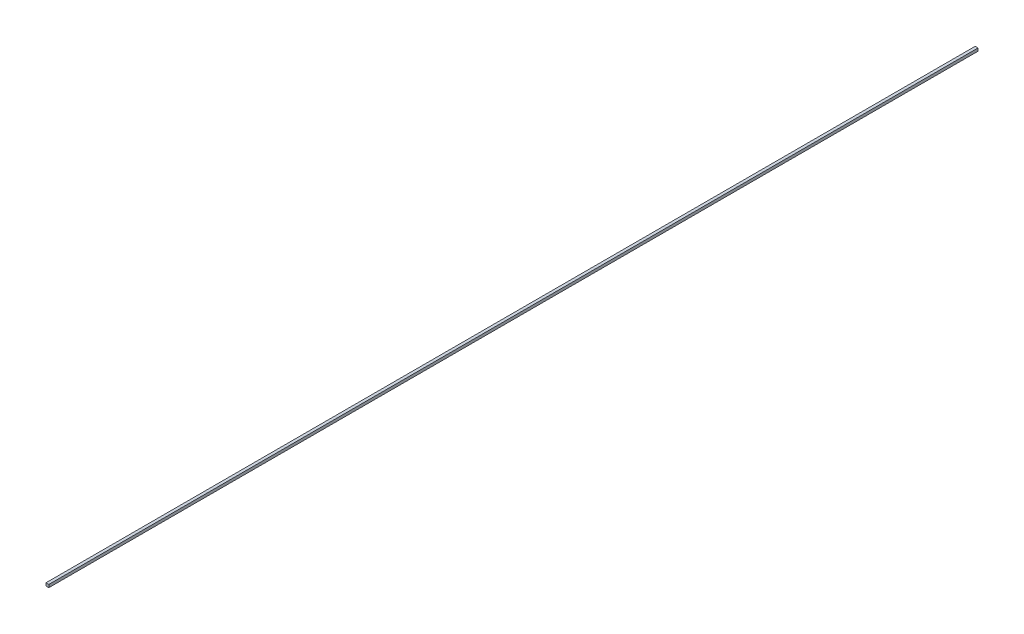
ISO-10303-21;
HEADER;
FILE_DESCRIPTION(('STEP AP214'),'2;1');
FILE_NAME('part.step','',(''),(''),'','','');
FILE_SCHEMA(('AUTOMOTIVE_DESIGN { 1 0 10303 214 1 1 1 1 }'));
ENDSEC;
DATA;
#1=APPLICATION_CONTEXT('core data for automotive mechanical design processes');
#2=APPLICATION_PROTOCOL_DEFINITION('international standard','automotive_design',2000,#1);
#3=PRODUCT_CONTEXT('',#1,'mechanical');
#4=PRODUCT('Part','Part','',(#3));
#5=PRODUCT_RELATED_PRODUCT_CATEGORY('part','',(#4));
#6=PRODUCT_DEFINITION_FORMATION('','',#4);
#7=PRODUCT_DEFINITION_CONTEXT('part definition',#1,'design');
#8=PRODUCT_DEFINITION('design','',#6,#7);
#9=PRODUCT_DEFINITION_SHAPE('','',#8);
#10=(LENGTH_UNIT() NAMED_UNIT(*) SI_UNIT(.MILLI.,.METRE.));
#11=(NAMED_UNIT(*) PLANE_ANGLE_UNIT() SI_UNIT($,.RADIAN.));
#12=(NAMED_UNIT(*) SI_UNIT($,.STERADIAN.) SOLID_ANGLE_UNIT());
#13=UNCERTAINTY_MEASURE_WITH_UNIT(LENGTH_MEASURE(1.E-05),#10,'distance_accuracy_value','');
#14=(GEOMETRIC_REPRESENTATION_CONTEXT(3) GLOBAL_UNCERTAINTY_ASSIGNED_CONTEXT((#13)) GLOBAL_UNIT_ASSIGNED_CONTEXT((#10,
#11,#12)) REPRESENTATION_CONTEXT('',''));
#15=CARTESIAN_POINT('',(0.,0.,0.));
#16=DIRECTION('',(0.,0.,1.));
#17=DIRECTION('',(1.,0.,0.));
#18=AXIS2_PLACEMENT_3D('',#15,#16,#17);
#19=CARTESIAN_POINT('',(0.,0.,651.8));
#20=DIRECTION('',(1.,0.,0.));
#21=DIRECTION('',(0.,0.,-1.));
#22=AXIS2_PLACEMENT_3D('',#19,#20,#21);
#23=PLANE('',#22);
#24=DIRECTION('',(0.,-1.,0.));
#25=VECTOR('',#24,1.);
#26=CARTESIAN_POINT('',(0.,0.,0.));
#27=LINE('',#26,#25);
#28=CARTESIAN_POINT('',(0.,2.,0.));
#29=VERTEX_POINT('',#28);
#30=CARTESIAN_POINT('',(0.,0.,0.));
#31=VERTEX_POINT('',#30);
#32=EDGE_CURVE('E100',#29,#31,#27,.T.);
#33=ORIENTED_EDGE('',*,*,#32,.T.);
#34=DIRECTION('',(0.,0.,-1.));
#35=VECTOR('',#34,1.);
#36=CARTESIAN_POINT('',(0.,0.,651.8));
#37=LINE('',#36,#35);
#38=CARTESIAN_POINT('',(0.,0.,651.8));
#39=VERTEX_POINT('',#38);
#40=EDGE_CURVE('E11',#39,#31,#37,.T.);
#41=ORIENTED_EDGE('',*,*,#40,.F.);
#42=DIRECTION('',(0.,-1.,0.));
#43=VECTOR('',#42,1.);
#44=CARTESIAN_POINT('',(0.,0.,651.8));
#45=LINE('',#44,#43);
#46=CARTESIAN_POINT('',(0.,2.,651.8));
#47=VERTEX_POINT('',#46);
#48=EDGE_CURVE('E88',#47,#39,#45,.T.);
#49=ORIENTED_EDGE('',*,*,#48,.F.);
#50=DIRECTION('',(0.,0.,-1.));
#51=VECTOR('',#50,1.);
#52=CARTESIAN_POINT('',(0.,2.,651.8));
#53=LINE('',#52,#51);
#54=EDGE_CURVE('E96',#47,#29,#53,.T.);
#55=ORIENTED_EDGE('',*,*,#54,.T.);
#56=EDGE_LOOP('',(#33,#41,#49,#55));
#57=FACE_BOUND('',#56,.T.);
#58=ADVANCED_FACE('F37',(#57),#23,.F.);
#59=CARTESIAN_POINT('',(0.,0.,651.8));
#60=DIRECTION('',(0.,1.,0.));
#61=DIRECTION('',(0.,0.,1.));
#62=AXIS2_PLACEMENT_3D('',#59,#60,#61);
#63=PLANE('',#62);
#64=DIRECTION('',(1.,0.,0.));
#65=VECTOR('',#64,1.);
#66=CARTESIAN_POINT('',(0.,0.,0.));
#67=LINE('',#66,#65);
#68=CARTESIAN_POINT('',(2.,0.,0.));
#69=VERTEX_POINT('',#68);
#70=EDGE_CURVE('E92',#31,#69,#67,.T.);
#71=ORIENTED_EDGE('',*,*,#70,.T.);
#72=DIRECTION('',(0.,0.,-1.));
#73=VECTOR('',#72,1.);
#74=CARTESIAN_POINT('',(2.,0.,651.8));
#75=LINE('',#74,#73);
#76=CARTESIAN_POINT('',(2.,0.,651.8));
#77=VERTEX_POINT('',#76);
#78=EDGE_CURVE('E45',#77,#69,#75,.T.);
#79=ORIENTED_EDGE('',*,*,#78,.F.);
#80=DIRECTION('',(1.,0.,0.));
#81=VECTOR('',#80,1.);
#82=CARTESIAN_POINT('',(0.,0.,651.8));
#83=LINE('',#82,#81);
#84=EDGE_CURVE('E83',#39,#77,#83,.T.);
#85=ORIENTED_EDGE('',*,*,#84,.F.);
#86=ORIENTED_EDGE('',*,*,#40,.T.);
#87=EDGE_LOOP('',(#71,#79,#85,#86));
#88=FACE_BOUND('',#87,.T.);
#89=ADVANCED_FACE('F91',(#88),#63,.F.);
#90=CARTESIAN_POINT('',(2.,0.,651.8));
#91=DIRECTION('',(-1.,0.,0.));
#92=DIRECTION('',(0.,-1.,0.));
#93=AXIS2_PLACEMENT_3D('',#90,#91,#92);
#94=PLANE('',#93);
#95=DIRECTION('',(0.,1.,0.));
#96=VECTOR('',#95,1.);
#97=CARTESIAN_POINT('',(2.,0.,0.));
#98=LINE('',#97,#96);
#99=CARTESIAN_POINT('',(2.,2.,0.));
#100=VERTEX_POINT('',#99);
#101=EDGE_CURVE('E70',#69,#100,#98,.T.);
#102=ORIENTED_EDGE('',*,*,#101,.T.);
#103=DIRECTION('',(0.,0.,-1.));
#104=VECTOR('',#103,1.);
#105=CARTESIAN_POINT('',(2.,2.,651.8));
#106=LINE('',#105,#104);
#107=CARTESIAN_POINT('',(2.,2.,651.8));
#108=VERTEX_POINT('',#107);
#109=EDGE_CURVE('E93',#108,#100,#106,.T.);
#110=ORIENTED_EDGE('',*,*,#109,.F.);
#111=DIRECTION('',(0.,1.,0.));
#112=VECTOR('',#111,1.);
#113=CARTESIAN_POINT('',(2.,0.,651.8));
#114=LINE('',#113,#112);
#115=EDGE_CURVE('E86',#77,#108,#114,.T.);
#116=ORIENTED_EDGE('',*,*,#115,.F.);
#117=ORIENTED_EDGE('',*,*,#78,.T.);
#118=EDGE_LOOP('',(#102,#110,#116,#117));
#119=FACE_BOUND('',#118,.T.);
#120=ADVANCED_FACE('F94',(#119),#94,.F.);
#121=CARTESIAN_POINT('',(0.,2.,651.8));
#122=DIRECTION('',(0.,-1.,0.));
#123=DIRECTION('',(0.,0.,-1.));
#124=AXIS2_PLACEMENT_3D('',#121,#122,#123);
#125=PLANE('',#124);
#126=DIRECTION('',(-1.,0.,0.));
#127=VECTOR('',#126,1.);
#128=CARTESIAN_POINT('',(0.,2.,0.));
#129=LINE('',#128,#127);
#130=EDGE_CURVE('E76',#100,#29,#129,.T.);
#131=ORIENTED_EDGE('',*,*,#130,.T.);
#132=ORIENTED_EDGE('',*,*,#54,.F.);
#133=DIRECTION('',(-1.,0.,0.));
#134=VECTOR('',#133,1.);
#135=CARTESIAN_POINT('',(0.,2.,651.8));
#136=LINE('',#135,#134);
#137=EDGE_CURVE('E53',#108,#47,#136,.T.);
#138=ORIENTED_EDGE('',*,*,#137,.F.);
#139=ORIENTED_EDGE('',*,*,#109,.T.);
#140=EDGE_LOOP('',(#131,#132,#138,#139));
#141=FACE_BOUND('',#140,.T.);
#142=ADVANCED_FACE('F107',(#141),#125,.F.);
#143=CARTESIAN_POINT('',(0.,0.,651.8));
#144=DIRECTION('',(0.,0.,-1.));
#145=DIRECTION('',(-1.,0.,0.));
#146=AXIS2_PLACEMENT_3D('',#143,#144,#145);
#147=PLANE('',#146);
#148=ORIENTED_EDGE('',*,*,#48,.T.);
#149=ORIENTED_EDGE('',*,*,#84,.T.);
#150=ORIENTED_EDGE('',*,*,#115,.T.);
#151=ORIENTED_EDGE('',*,*,#137,.T.);
#152=EDGE_LOOP('',(#148,#149,#150,#151));
#153=FACE_BOUND('',#152,.T.);
#154=ADVANCED_FACE('F84',(#153),#147,.F.);
#155=CARTESIAN_POINT('',(0.,0.,0.));
#156=DIRECTION('',(0.,0.,-1.));
#157=DIRECTION('',(-1.,0.,0.));
#158=AXIS2_PLACEMENT_3D('',#155,#156,#157);
#159=PLANE('',#158);
#160=ORIENTED_EDGE('',*,*,#32,.F.);
#161=ORIENTED_EDGE('',*,*,#130,.F.);
#162=ORIENTED_EDGE('',*,*,#101,.F.);
#163=ORIENTED_EDGE('',*,*,#70,.F.);
#164=EDGE_LOOP('',(#160,#161,#162,#163));
#165=FACE_BOUND('',#164,.T.);
#166=ADVANCED_FACE('F110',(#165),#159,.T.);
#167=CLOSED_SHELL('',(#58,#89,#120,#142,#154,#166));
#168=MANIFOLD_SOLID_BREP('B2',#167);
#169=ADVANCED_BREP_SHAPE_REPRESENTATION('',(#18,#168),#14);
#170=SHAPE_DEFINITION_REPRESENTATION(#9,#169);
ENDSEC;
END-ISO-10303-21;
